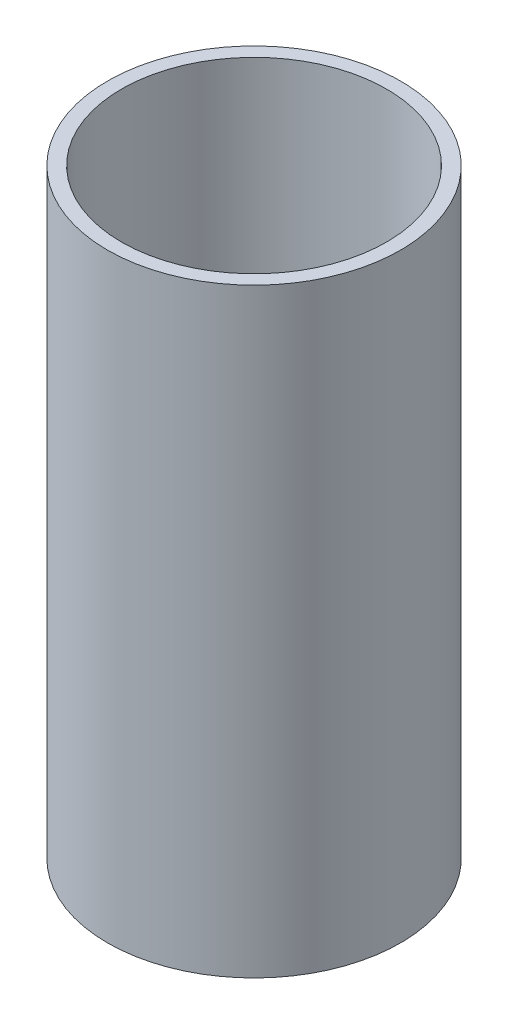
ISO-10303-21;
HEADER;
FILE_DESCRIPTION(('STEP AP214'),'2;1');
FILE_NAME('part.step','',(''),(''),'','','');
FILE_SCHEMA(('AUTOMOTIVE_DESIGN { 1 0 10303 214 1 1 1 1 }'));
ENDSEC;
DATA;
#1=APPLICATION_CONTEXT('core data for automotive mechanical design processes');
#2=APPLICATION_PROTOCOL_DEFINITION('international standard','automotive_design',2000,#1);
#3=PRODUCT_CONTEXT('',#1,'mechanical');
#4=PRODUCT('Part','Part','',(#3));
#5=PRODUCT_RELATED_PRODUCT_CATEGORY('part','',(#4));
#6=PRODUCT_DEFINITION_FORMATION('','',#4);
#7=PRODUCT_DEFINITION_CONTEXT('part definition',#1,'design');
#8=PRODUCT_DEFINITION('design','',#6,#7);
#9=PRODUCT_DEFINITION_SHAPE('','',#8);
#10=(LENGTH_UNIT() NAMED_UNIT(*) SI_UNIT(.MILLI.,.METRE.));
#11=(NAMED_UNIT(*) PLANE_ANGLE_UNIT() SI_UNIT($,.RADIAN.));
#12=(NAMED_UNIT(*) SI_UNIT($,.STERADIAN.) SOLID_ANGLE_UNIT());
#13=UNCERTAINTY_MEASURE_WITH_UNIT(LENGTH_MEASURE(1.E-05),#10,'distance_accuracy_value','');
#14=(GEOMETRIC_REPRESENTATION_CONTEXT(3) GLOBAL_UNCERTAINTY_ASSIGNED_CONTEXT((#13)) GLOBAL_UNIT_ASSIGNED_CONTEXT((#10,
#11,#12)) REPRESENTATION_CONTEXT('',''));
#15=CARTESIAN_POINT('',(0.,0.,0.));
#16=DIRECTION('',(0.,0.,1.));
#17=DIRECTION('',(1.,0.,0.));
#18=AXIS2_PLACEMENT_3D('',#15,#16,#17);
#19=CARTESIAN_POINT('',(0.,43.,0.));
#20=DIRECTION('',(0.,1.,0.));
#21=DIRECTION('',(0.,0.,1.));
#22=AXIS2_PLACEMENT_3D('',#19,#20,#21);
#23=PLANE('',#22);
#24=CARTESIAN_POINT('',(0.,43.,0.));
#25=DIRECTION('',(0.,1.,0.));
#26=DIRECTION('',(0.,0.,1.));
#27=AXIS2_PLACEMENT_3D('',#24,#25,#26);
#28=CIRCLE('',#27,10.5);
#29=CARTESIAN_POINT('',(0.,43.,10.5));
#30=VERTEX_POINT('',#29);
#31=EDGE_CURVE('E10',#30,#30,#28,.T.);
#32=ORIENTED_EDGE('',*,*,#31,.T.);
#33=EDGE_LOOP('',(#32));
#34=FACE_BOUND('',#33,.T.);
#35=CARTESIAN_POINT('',(0.,43.,0.));
#36=DIRECTION('',(0.,1.,0.));
#37=DIRECTION('',(0.,0.,1.));
#38=AXIS2_PLACEMENT_3D('',#35,#36,#37);
#39=CIRCLE('',#38,9.5);
#40=CARTESIAN_POINT('',(0.,43.,9.5));
#41=VERTEX_POINT('',#40);
#42=EDGE_CURVE('E54',#41,#41,#39,.T.);
#43=ORIENTED_EDGE('',*,*,#42,.F.);
#44=EDGE_LOOP('',(#43));
#45=FACE_BOUND('',#44,.T.);
#46=ADVANCED_FACE('F41',(#34,#45),#23,.T.);
#47=CARTESIAN_POINT('',(0.,0.,0.));
#48=DIRECTION('',(0.,1.,0.));
#49=DIRECTION('',(0.,0.,1.));
#50=AXIS2_PLACEMENT_3D('',#47,#48,#49);
#51=PLANE('',#50);
#52=CARTESIAN_POINT('',(0.,0.,0.));
#53=DIRECTION('',(0.,1.,0.));
#54=DIRECTION('',(0.,0.,1.));
#55=AXIS2_PLACEMENT_3D('',#52,#53,#54);
#56=CIRCLE('',#55,10.5);
#57=CARTESIAN_POINT('',(0.,0.,10.5));
#58=VERTEX_POINT('',#57);
#59=EDGE_CURVE('E45',#58,#58,#56,.T.);
#60=ORIENTED_EDGE('',*,*,#59,.F.);
#61=EDGE_LOOP('',(#60));
#62=FACE_BOUND('',#61,.T.);
#63=CARTESIAN_POINT('',(0.,0.,0.));
#64=DIRECTION('',(0.,1.,0.));
#65=DIRECTION('',(0.,0.,1.));
#66=AXIS2_PLACEMENT_3D('',#63,#64,#65);
#67=CIRCLE('',#66,9.5);
#68=CARTESIAN_POINT('',(0.,0.,9.5));
#69=VERTEX_POINT('',#68);
#70=EDGE_CURVE('E56',#69,#69,#67,.T.);
#71=ORIENTED_EDGE('',*,*,#70,.T.);
#72=EDGE_LOOP('',(#71));
#73=FACE_BOUND('',#72,.T.);
#74=ADVANCED_FACE('F68',(#62,#73),#51,.F.);
#75=CARTESIAN_POINT('',(0.,43.,0.));
#76=DIRECTION('',(0.,-1.,0.));
#77=DIRECTION('',(0.,0.,-1.));
#78=AXIS2_PLACEMENT_3D('',#75,#76,#77);
#79=CYLINDRICAL_SURFACE('',#78,10.5);
#80=ORIENTED_EDGE('',*,*,#31,.F.);
#81=EDGE_LOOP('',(#80));
#82=FACE_BOUND('',#81,.T.);
#83=ORIENTED_EDGE('',*,*,#59,.T.);
#84=EDGE_LOOP('',(#83));
#85=FACE_BOUND('',#84,.T.);
#86=ADVANCED_FACE('F43',(#82,#85),#79,.T.);
#87=CARTESIAN_POINT('',(0.,43.,0.));
#88=DIRECTION('',(0.,-1.,0.));
#89=DIRECTION('',(0.,0.,-1.));
#90=AXIS2_PLACEMENT_3D('',#87,#88,#89);
#91=CYLINDRICAL_SURFACE('',#90,9.5);
#92=ORIENTED_EDGE('',*,*,#42,.T.);
#93=EDGE_LOOP('',(#92));
#94=FACE_BOUND('',#93,.T.);
#95=ORIENTED_EDGE('',*,*,#70,.F.);
#96=EDGE_LOOP('',(#95));
#97=FACE_BOUND('',#96,.T.);
#98=ADVANCED_FACE('F64',(#94,#97),#91,.F.);
#99=CLOSED_SHELL('',(#46,#74,#86,#98));
#100=MANIFOLD_SOLID_BREP('B2',#99);
#101=ADVANCED_BREP_SHAPE_REPRESENTATION('',(#18,#100),#14);
#102=SHAPE_DEFINITION_REPRESENTATION(#9,#101);
ENDSEC;
END-ISO-10303-21;
